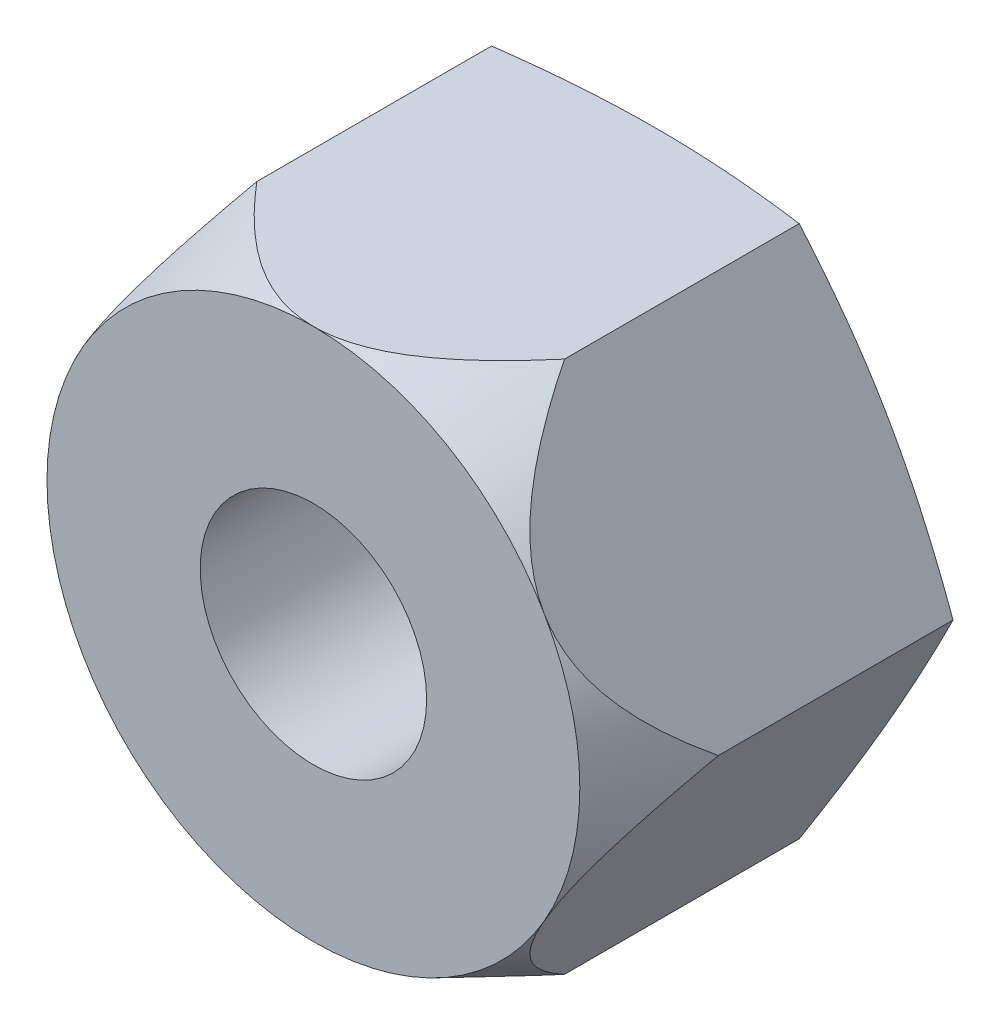
ISO-10303-21;
HEADER;
FILE_DESCRIPTION(('STEP AP214'),'2;1');
FILE_NAME('part.step','',(''),(''),'','','');
FILE_SCHEMA(('AUTOMOTIVE_DESIGN { 1 0 10303 214 1 1 1 1 }'));
ENDSEC;
DATA;
#1=APPLICATION_CONTEXT('core data for automotive mechanical design processes');
#2=APPLICATION_PROTOCOL_DEFINITION('international standard','automotive_design',2000,#1);
#3=PRODUCT_CONTEXT('',#1,'mechanical');
#4=PRODUCT('Part','Part','',(#3));
#5=PRODUCT_RELATED_PRODUCT_CATEGORY('part','',(#4));
#6=PRODUCT_DEFINITION_FORMATION('','',#4);
#7=PRODUCT_DEFINITION_CONTEXT('part definition',#1,'design');
#8=PRODUCT_DEFINITION('design','',#6,#7);
#9=PRODUCT_DEFINITION_SHAPE('','',#8);
#10=(LENGTH_UNIT() NAMED_UNIT(*) SI_UNIT(.MILLI.,.METRE.));
#11=(NAMED_UNIT(*) PLANE_ANGLE_UNIT() SI_UNIT($,.RADIAN.));
#12=(NAMED_UNIT(*) SI_UNIT($,.STERADIAN.) SOLID_ANGLE_UNIT());
#13=UNCERTAINTY_MEASURE_WITH_UNIT(LENGTH_MEASURE(1.E-05),#10,'distance_accuracy_value','');
#14=(GEOMETRIC_REPRESENTATION_CONTEXT(3) GLOBAL_UNCERTAINTY_ASSIGNED_CONTEXT((#13)) GLOBAL_UNIT_ASSIGNED_CONTEXT((#10,
#11,#12)) REPRESENTATION_CONTEXT('',''));
#15=CARTESIAN_POINT('',(0.,0.,0.));
#16=DIRECTION('',(0.,0.,1.));
#17=DIRECTION('',(1.,0.,0.));
#18=AXIS2_PLACEMENT_3D('',#15,#16,#17);
#19=CARTESIAN_POINT('',(0.,0.,-4.98224576043072));
#20=DIRECTION('',(0.,0.,1.));
#21=DIRECTION('',(1.,0.,0.));
#22=AXIS2_PLACEMENT_3D('',#19,#20,#21);
#23=CONICAL_SURFACE('',#22,4.62587496639344,1.30899693900267);
#24=CARTESIAN_POINT('',(-4.6188021535193,3.97450486742227E-12,-4.98414091492851));
#25=CARTESIAN_POINT('',(-4.52289851680874,-0.16610997140934,-5.00984794253957));
#26=CARTESIAN_POINT('',(-4.42682100646454,-0.332521100790216,-5.03318560339601));
#27=CARTESIAN_POINT('',(-4.23432671142184,-0.665930999971338,-5.07418759006574));
#28=CARTESIAN_POINT('',(-4.13790980496555,-0.832929980662246,-5.09184961193811));
#29=CARTESIAN_POINT('',(-3.94532123852523,-1.16650316269373,-5.12046930776978));
#30=CARTESIAN_POINT('',(-3.84915088056777,-1.33307510885814,-5.13146110886302));
#31=CARTESIAN_POINT('',(-3.65668753523402,-1.66643140157086,-5.14619998039367));
#32=CARTESIAN_POINT('',(-3.56039457518647,-1.83321570078443,-5.14994845223402));
#33=CARTESIAN_POINT('',(-3.36780865509136,-2.16678429921156,-5.14994845223408));
#34=CARTESIAN_POINT('',(-3.2715156950438,-2.33356859842513,-5.14619998039379));
#35=CARTESIAN_POINT('',(-3.07905234971006,-2.66692489113785,-5.13146110886325));
#36=CARTESIAN_POINT('',(-2.98288199175259,-2.83349683730227,-5.12046930777007));
#37=CARTESIAN_POINT('',(-2.79029342531227,-3.16707001933376,-5.0918496119385));
#38=CARTESIAN_POINT('',(-2.69387651885598,-3.33406900002467,-5.07418759006618));
#39=CARTESIAN_POINT('',(-2.50138222381327,-3.6674788992058,-5.03318560339655));
#40=CARTESIAN_POINT('',(-2.40530471346906,-3.83389002858668,-5.00984794254014));
#41=CARTESIAN_POINT('',(-2.3094010767585,-4.,-4.98414091492912));
#42=B_SPLINE_CURVE_WITH_KNOTS('',3,(#24,#25,#26,#27,#28,#29,#30,#31,#32,#33,#34,#35,#36,#37,#38,
#39,#40,#41),.UNSPECIFIED.,.F.,.F.,(4,2,2,2,2,2,2,2,4),(0.,0.580597318357496,1.16143002467372,
1.73926537056134,2.31698890857221,2.89471244658308,3.4725477924707,4.05338049878692,
4.63397781714442),.UNSPECIFIED.);
#43=CARTESIAN_POINT('',(-4.61880215351584,0.,-4.98414091494226));
#44=VERTEX_POINT('',#43);
#45=CARTESIAN_POINT('',(-2.30940107675851,-4.,-4.98414091492912));
#46=VERTEX_POINT('',#45);
#47=EDGE_CURVE('E282',#44,#46,#42,.T.);
#48=ORIENTED_EDGE('',*,*,#47,.F.);
#49=CARTESIAN_POINT('',(-2.3094010767585,4.,-4.98414091492912));
#50=CARTESIAN_POINT('',(-2.40530471346906,3.83389002858668,-5.00984794254015));
#51=CARTESIAN_POINT('',(-2.50138222381326,3.6674788992058,-5.03318560339655));
#52=CARTESIAN_POINT('',(-2.69387651885598,3.33406900002467,-5.07418759006618));
#53=CARTESIAN_POINT('',(-2.79029342531227,3.16707001933375,-5.0918496119385));
#54=CARTESIAN_POINT('',(-2.98288199175259,2.83349683730227,-5.12046930777007));
#55=CARTESIAN_POINT('',(-3.07905234971005,2.66692489113785,-5.13146110886325));
#56=CARTESIAN_POINT('',(-3.2715156950438,2.33356859842512,-5.14619998039379));
#57=CARTESIAN_POINT('',(-3.36780865509136,2.16678429921156,-5.14994845223408));
#58=CARTESIAN_POINT('',(-3.56039457518647,1.83321570078442,-5.14994845223402));
#59=CARTESIAN_POINT('',(-3.65668753523402,1.66643140157086,-5.14619998039367));
#60=CARTESIAN_POINT('',(-3.84915088056777,1.33307510885814,-5.13146110886302));
#61=CARTESIAN_POINT('',(-3.94532123852523,1.16650316269373,-5.12046930776978));
#62=CARTESIAN_POINT('',(-4.13790980496555,0.832929980662245,-5.09184961193811));
#63=CARTESIAN_POINT('',(-4.23432671142184,0.665930999971338,-5.07418759006574));
#64=CARTESIAN_POINT('',(-4.42682100646454,0.332521100790216,-5.03318560339601));
#65=CARTESIAN_POINT('',(-4.52289851680874,0.16610997140934,-5.00984794253957));
#66=CARTESIAN_POINT('',(-4.6188021535193,-3.97411267426706E-12,-4.98414091492851));
#67=B_SPLINE_CURVE_WITH_KNOTS('',3,(#49,#50,#51,#52,#53,#54,#55,#56,#57,#58,#59,#60,#61,#62,#63,
#64,#65,#66),.UNSPECIFIED.,.F.,.F.,(4,2,2,2,2,2,2,2,4),(0.,0.580597318357498,1.16143002467372,
1.73926537056135,2.31698890857221,2.89471244658308,3.4725477924707,4.05338049878692,
4.63397781714442),.UNSPECIFIED.);
#68=CARTESIAN_POINT('',(-2.30940107675851,4.,-4.98414091492912));
#69=VERTEX_POINT('',#68);
#70=EDGE_CURVE('E102',#69,#44,#67,.T.);
#71=ORIENTED_EDGE('',*,*,#70,.F.);
#72=CARTESIAN_POINT('',(2.3094010767585,4.,-4.98414091492912));
#73=CARTESIAN_POINT('',(2.11759380333757,4.,-5.00984794254012));
#74=CARTESIAN_POINT('',(1.92543878264936,4.,-5.0331856033965));
#75=CARTESIAN_POINT('',(1.54045019256432,4.,-5.0741875900661));
#76=CARTESIAN_POINT('',(1.34761637965193,4.,-5.09184961193842));
#77=CARTESIAN_POINT('',(0.962439246771681,4.,-5.12046930776998));
#78=CARTESIAN_POINT('',(0.770098530856941,4.,-5.13146110886317));
#79=CARTESIAN_POINT('',(0.385171840189831,4.,-5.14619998039373));
#80=CARTESIAN_POINT('',(0.192585920094911,4.,-5.14994845223405));
#81=CARTESIAN_POINT('',(-0.19258592009493,4.,-5.14994845223405));
#82=CARTESIAN_POINT('',(-0.385171840189851,4.,-5.14619998039373));
#83=CARTESIAN_POINT('',(-0.770098530856961,4.,-5.13146110886317));
#84=CARTESIAN_POINT('',(-0.962439246771701,4.,-5.12046930776998));
#85=CARTESIAN_POINT('',(-1.34761637965195,4.,-5.09184961193841));
#86=CARTESIAN_POINT('',(-1.54045019256434,4.,-5.0741875900661));
#87=CARTESIAN_POINT('',(-1.92543878264938,4.,-5.0331856033965));
#88=CARTESIAN_POINT('',(-2.11759380333759,4.,-5.00984794254012));
#89=CARTESIAN_POINT('',(-2.30940107675852,4.,-4.98414091492912));
#90=B_SPLINE_CURVE_WITH_KNOTS('',3,(#72,#73,#74,#75,#76,#77,#78,#79,#80,#81,#82,#83,#84,#85,#86,
#87,#88,#89),.UNSPECIFIED.,.F.,.F.,(4,2,2,2,2,2,2,2,4),(0.,0.580597318356917,1.16143002467256,
1.73926537055961,2.3169889085699,2.8947124465802,3.47254779246724,4.05338049878289,
4.63397781713981),.UNSPECIFIED.);
#91=CARTESIAN_POINT('',(2.30940107675849,4.,-4.98414091492912));
#92=VERTEX_POINT('',#91);
#93=EDGE_CURVE('E96',#92,#69,#90,.T.);
#94=ORIENTED_EDGE('',*,*,#93,.F.);
#95=CARTESIAN_POINT('',(4.61880215351929,-3.98376161446537E-12,-4.98414091492851));
#96=CARTESIAN_POINT('',(4.52289851680873,0.166109971409331,-5.00984794253957));
#97=CARTESIAN_POINT('',(4.42682100646454,0.332521100790208,-5.03318560339601));
#98=CARTESIAN_POINT('',(4.23432671142183,0.665930999971331,-5.07418759006574));
#99=CARTESIAN_POINT('',(4.13790980496554,0.83292998066224,-5.09184961193811));
#100=CARTESIAN_POINT('',(3.94532123852522,1.16650316269372,-5.12046930776978));
#101=CARTESIAN_POINT('',(3.84915088056776,1.33307510885814,-5.13146110886302));
#102=CARTESIAN_POINT('',(3.65668753523401,1.66643140157086,-5.14619998039367));
#103=CARTESIAN_POINT('',(3.56039457518646,1.83321570078442,-5.14994845223402));
#104=CARTESIAN_POINT('',(3.36780865509135,2.16678429921156,-5.14994845223408));
#105=CARTESIAN_POINT('',(3.27151569504379,2.33356859842512,-5.14619998039379));
#106=CARTESIAN_POINT('',(3.07905234971004,2.66692489113785,-5.13146110886325));
#107=CARTESIAN_POINT('',(2.98288199175258,2.83349683730227,-5.12046930777007));
#108=CARTESIAN_POINT('',(2.79029342531226,3.16707001933376,-5.0918496119385));
#109=CARTESIAN_POINT('',(2.69387651885596,3.33406900002467,-5.07418759006618));
#110=CARTESIAN_POINT('',(2.50138222381325,3.6674788992058,-5.03318560339655));
#111=CARTESIAN_POINT('',(2.40530471346905,3.83389002858669,-5.00984794254015));
#112=CARTESIAN_POINT('',(2.30940107675849,4.00000000000001,-4.98414091492912));
#113=B_SPLINE_CURVE_WITH_KNOTS('',3,(#95,#96,#97,#98,#99,#100,#101,#102,#103,#104,#105,#106,
#107,#108,#109,#110,#111,#112),.UNSPECIFIED.,.F.,.F.,(4,2,2,2,2,2,2,2,4),(0.,0.580597318357499,
1.16143002467372,1.73926537056135,2.31698890857221,2.89471244658308,3.47254779247071,
4.05338049878694,4.63397781714444),.UNSPECIFIED.);
#114=CARTESIAN_POINT('',(4.61880215358719,0.,-4.98414091492805));
#115=VERTEX_POINT('',#114);
#116=EDGE_CURVE('E85',#115,#92,#113,.T.);
#117=ORIENTED_EDGE('',*,*,#116,.F.);
#118=CARTESIAN_POINT('',(2.3094010767585,-4.00000000000001,-4.98414091492912));
#119=CARTESIAN_POINT('',(2.40530471346906,-3.83389002858669,-5.00984794254014));
#120=CARTESIAN_POINT('',(2.50138222381326,-3.66747889920581,-5.03318560339655));
#121=CARTESIAN_POINT('',(2.69387651885598,-3.33406900002467,-5.07418759006618));
#122=CARTESIAN_POINT('',(2.79029342531227,-3.16707001933376,-5.0918496119385));
#123=CARTESIAN_POINT('',(2.98288199175259,-2.83349683730227,-5.12046930777007));
#124=CARTESIAN_POINT('',(3.07905234971005,-2.66692489113786,-5.13146110886325));
#125=CARTESIAN_POINT('',(3.2715156950438,-2.33356859842513,-5.14619998039378));
#126=CARTESIAN_POINT('',(3.36780865509136,-2.16678429921157,-5.14994845223408));
#127=CARTESIAN_POINT('',(3.56039457518647,-1.83321570078443,-5.14994845223402));
#128=CARTESIAN_POINT('',(3.65668753523402,-1.66643140157087,-5.14619998039367));
#129=CARTESIAN_POINT('',(3.84915088056777,-1.33307510885815,-5.13146110886301));
#130=CARTESIAN_POINT('',(3.94532123852523,-1.16650316269373,-5.12046930776978));
#131=CARTESIAN_POINT('',(4.13790980496555,-0.832929980662255,-5.0918496119381));
#132=CARTESIAN_POINT('',(4.23432671142184,-0.665930999971347,-5.07418759006573));
#133=CARTESIAN_POINT('',(4.42682100646454,-0.332521100790225,-5.03318560339601));
#134=CARTESIAN_POINT('',(4.52289851680874,-0.166109971409349,-5.00984794253957));
#135=CARTESIAN_POINT('',(4.6188021535193,3.96478950255242E-12,-4.9841409149285));
#136=B_SPLINE_CURVE_WITH_KNOTS('',3,(#118,#119,#120,#121,#122,#123,#124,#125,#126,#127,#128,
#129,#130,#131,#132,#133,#134,#135),.UNSPECIFIED.,.F.,.F.,(4,2,2,2,2,2,2,2,4),(0.,
0.580597318357498,1.16143002467372,1.73926537056135,2.31698890857221,2.89471244658308,
3.4725477924707,4.05338049878692,4.63397781714442),.UNSPECIFIED.);
#137=CARTESIAN_POINT('',(2.30940107675851,-4.,-4.98414091492912));
#138=VERTEX_POINT('',#137);
#139=EDGE_CURVE('E109',#138,#115,#136,.T.);
#140=ORIENTED_EDGE('',*,*,#139,.F.);
#141=CARTESIAN_POINT('',(-2.30940107675852,-4.,-4.98414091492912));
#142=CARTESIAN_POINT('',(-2.11759380333759,-4.,-5.00984794254012));
#143=CARTESIAN_POINT('',(-1.92543878264938,-4.,-5.0331856033965));
#144=CARTESIAN_POINT('',(-1.54045019256434,-4.,-5.0741875900661));
#145=CARTESIAN_POINT('',(-1.34761637965195,-4.,-5.09184961193841));
#146=CARTESIAN_POINT('',(-0.962439246771699,-4.,-5.12046930776998));
#147=CARTESIAN_POINT('',(-0.770098530856958,-4.,-5.13146110886317));
#148=CARTESIAN_POINT('',(-0.385171840189846,-4.,-5.14619998039373));
#149=CARTESIAN_POINT('',(-0.192585920094925,-4.,-5.14994845223405));
#150=CARTESIAN_POINT('',(0.192585920094917,-4.,-5.14994845223405));
#151=CARTESIAN_POINT('',(0.385171840189838,-4.,-5.14619998039373));
#152=CARTESIAN_POINT('',(0.770098530856949,-4.,-5.13146110886317));
#153=CARTESIAN_POINT('',(0.96243924677169,-4.,-5.12046930776998));
#154=CARTESIAN_POINT('',(1.34761637965194,-4.,-5.09184961193842));
#155=CARTESIAN_POINT('',(1.54045019256433,-4.,-5.0741875900661));
#156=CARTESIAN_POINT('',(1.92543878264937,-4.,-5.0331856033965));
#157=CARTESIAN_POINT('',(2.11759380333758,-4.,-5.00984794254012));
#158=CARTESIAN_POINT('',(2.30940107675851,-4.,-4.98414091492912));
#159=B_SPLINE_CURVE_WITH_KNOTS('',3,(#141,#142,#143,#144,#145,#146,#147,#148,#149,#150,#151,
#152,#153,#154,#155,#156,#157,#158),.UNSPECIFIED.,.F.,.F.,(4,2,2,2,2,2,2,2,4),(0.,
0.580597318356918,1.16143002467256,1.73926537055961,2.31698890856991,2.89471244658021,
3.47254779246725,4.0533804987829,4.63397781713982),.UNSPECIFIED.);
#160=EDGE_CURVE('E227',#46,#138,#159,.T.);
#161=ORIENTED_EDGE('',*,*,#160,.F.);
#162=EDGE_LOOP('',(#48,#71,#94,#117,#140,#161));
#163=FACE_BOUND('',#162,.T.);
#164=CARTESIAN_POINT('',(0.,0.,-5.30000000000337));
#165=DIRECTION('',(0.,0.,1.));
#166=DIRECTION('',(1.,0.,0.));
#167=AXIS2_PLACEMENT_3D('',#164,#165,#166);
#168=CIRCLE('',#167,3.43999999995503);
#169=CARTESIAN_POINT('',(3.43999999995504,0.,-5.30000000000337));
#170=VERTEX_POINT('',#169);
#171=EDGE_CURVE('E21',#170,#170,#168,.F.);
#172=ORIENTED_EDGE('',*,*,#171,.F.);
#173=EDGE_LOOP('',(#172));
#174=FACE_BOUND('',#173,.T.);
#175=ADVANCED_FACE('F17',(#163,#174),#23,.T.);
#176=CARTESIAN_POINT('',(-2.30940107675851,-4.,-5.3));
#177=DIRECTION('',(0.,0.,-1.));
#178=DIRECTION('',(-1.,0.,0.));
#179=AXIS2_PLACEMENT_3D('',#176,#177,#178);
#180=PLANE('',#179);
#181=CARTESIAN_POINT('',(0.,0.,-5.29999999997699));
#182=DIRECTION('',(0.,0.,-1.));
#183=DIRECTION('',(-1.,0.,0.));
#184=AXIS2_PLACEMENT_3D('',#181,#182,#183);
#185=CIRCLE('',#184,2.18571428570158);
#186=CARTESIAN_POINT('',(-2.18571428570158,0.,-5.29999999997699));
#187=VERTEX_POINT('',#186);
#188=EDGE_CURVE('E173',#187,#187,#185,.F.);
#189=ORIENTED_EDGE('',*,*,#188,.T.);
#190=EDGE_LOOP('',(#189));
#191=FACE_BOUND('',#190,.T.);
#192=ORIENTED_EDGE('',*,*,#171,.T.);
#193=EDGE_LOOP('',(#192));
#194=FACE_BOUND('',#193,.T.);
#195=ADVANCED_FACE('F209',(#191,#194),#180,.T.);
#196=CARTESIAN_POINT('',(2.3094010767585,4.,-5.3));
#197=DIRECTION('',(0.,1.,0.));
#198=DIRECTION('',(0.,0.,1.));
#199=AXIS2_PLACEMENT_3D('',#196,#197,#198);
#200=PLANE('',#199);
#201=DIRECTION('',(0.,0.,1.));
#202=VECTOR('',#201,1.);
#203=CARTESIAN_POINT('',(-2.3094010767585,3.99999999999999,-5.3));
#204=LINE('',#203,#202);
#205=CARTESIAN_POINT('',(-2.3094010767585,4.,-1.46000000001793));
#206=VERTEX_POINT('',#205);
#207=EDGE_CURVE('E288',#206,#69,#204,.F.);
#208=ORIENTED_EDGE('',*,*,#207,.F.);
#209=CARTESIAN_POINT('',(0.,4.,-3.22090205740249E-11));
#210=CARTESIAN_POINT('',(-0.0537784669086683,4.,3.33773102398751E-05));
#211=CARTESIAN_POINT('',(-0.107536978097439,4.,-0.00255779469879392));
#212=CARTESIAN_POINT('',(-0.214493796358574,4.,-0.012728405164682));
#213=CARTESIAN_POINT('',(-0.267692881313333,4.,-0.0202996071916052));
#214=CARTESIAN_POINT('',(-0.372186558712668,4.,-0.0399818476691536));
#215=CARTESIAN_POINT('',(-0.423498127008806,4.,-0.0520037081479562));
#216=CARTESIAN_POINT('',(-0.524978040147191,4.,-0.080191506086133));
#217=CARTESIAN_POINT('',(-0.575145857851012,4.,-0.0963593139282062));
#218=CARTESIAN_POINT('',(-0.761818150694413,4.,-0.164322984169127));
#219=CARTESIAN_POINT('',(-0.893874577135787,4.,-0.228506313186122));
#220=CARTESIAN_POINT('',(-1.14834058570262,4.,-0.376799470928344));
#221=CARTESIAN_POINT('',(-1.27057011529377,4.,-0.461201171937723));
#222=CARTESIAN_POINT('',(-1.4747325651839,4.,-0.619132453478493));
#223=CARTESIAN_POINT('',(-1.55891031365921,4.,-0.689826568359658));
#224=CARTESIAN_POINT('',(-1.7226703586599,4.,-0.836452685587209));
#225=CARTESIAN_POINT('',(-1.80224875046165,4.,-0.91238902182539));
#226=CARTESIAN_POINT('',(-1.95484377511185,4.,-1.06551921784311));
#227=CARTESIAN_POINT('',(-2.02799124175388,4.,-1.14258403691733));
#228=CARTESIAN_POINT('',(-2.17098783749922,4.,-1.29941806890039));
#229=CARTESIAN_POINT('',(-2.24084376023403,4.,-1.37918107007029));
#230=CARTESIAN_POINT('',(-2.30940104684113,4.,-1.45999996474238));
#231=B_SPLINE_CURVE_WITH_KNOTS('',3,(#209,#210,#211,#212,#213,#214,#215,#216,#217,#218,#219,
#220,#221,#222,#223,#224,#225,#226,#227,#228,#229,#230),.UNSPECIFIED.,.F.,.F.,(4,2,2,2,2,2,2,2,
2,2,4),(0.,0.16124098575657,0.322215964679933,0.48012615464331,0.638107709162955,
1.07587782815675,1.52039511682573,1.84992335772821,2.17972736910376,2.49839517165825,
2.81637352980213),.UNSPECIFIED.);
#232=CARTESIAN_POINT('',(0.,4.00000000000522,-4.4526033373853E-11));
#233=VERTEX_POINT('',#232);
#234=EDGE_CURVE('E172',#233,#206,#231,.T.);
#235=ORIENTED_EDGE('',*,*,#234,.F.);
#236=CARTESIAN_POINT('',(2.30940103065065,3.99999999369635,-1.45999994891579));
#237=CARTESIAN_POINT('',(2.26530046156806,3.99999999767564,-1.40798095750892));
#238=CARTESIAN_POINT('',(2.2206560777249,3.99999999936311,-1.35642434261895));
#239=CARTESIAN_POINT('',(2.13013237326658,4.00000000063709,-1.25438039860766));
#240=CARTESIAN_POINT('',(2.08425268638726,4.00000000022296,-1.20389339473106));
#241=CARTESIAN_POINT('',(1.94390024767038,3.99999999955082,-1.05357249315271));
#242=CARTESIAN_POINT('',(1.84735383691979,3.99999999987745,-0.955642878771101));
#243=CARTESIAN_POINT('',(1.64302743666835,4.00000000012804,-0.762641424038905));
#244=CARTESIAN_POINT('',(1.53493795617419,4.0000000000333,-0.667894156896339));
#245=CARTESIAN_POINT('',(1.30988675002703,3.99999999996681,-0.490006633784196));
#246=CARTESIAN_POINT('',(1.19295612201515,3.99999999999465,-0.406828371796886));
#247=CARTESIAN_POINT('',(1.02062803664969,4.00000000000219,-0.30170895528666));
#248=CARTESIAN_POINT('',(0.969609414312936,4.0000000000006,-0.27258253429274));
#249=CARTESIAN_POINT('',(0.865746618975963,3.9999999999994,-0.217779364108761));
#250=CARTESIAN_POINT('',(0.812901990955628,3.99999999999979,-0.192103482661984));
#251=CARTESIAN_POINT('',(0.65301047541937,4.00000000000041,-0.121785300131507));
#252=CARTESIAN_POINT('',(0.543221636241228,4.00000000000009,-0.0829759309315579));
#253=CARTESIAN_POINT('',(0.360877257342339,3.99999999999994,-0.0369135205006762));
#254=CARTESIAN_POINT('',(0.28991408374772,3.99999999999997,-0.0232784276174035));
#255=CARTESIAN_POINT('',(0.146014698710497,4.00000000000003,-0.00472326376504452));
#256=CARTESIAN_POINT('',(0.0730650705247637,4.00000000000006,9.15862542672063E-05));
#257=CARTESIAN_POINT('',(0.,4.,-3.22093049741718E-11));
#258=B_SPLINE_CURVE_WITH_KNOTS('',3,(#236,#237,#238,#239,#240,#241,#242,#243,#244,#245,#246,
#247,#248,#249,#250,#251,#252,#253,#254,#255,#256,#257),.UNSPECIFIED.,.F.,.F.,(4,2,2,2,2,2,2,2,
2,2,4),(0.,0.204582629009847,0.409226599130053,0.821501014047106,1.25224519084228,
1.68153907824911,1.85766275158224,2.03383063402477,2.38129134616519,2.59756782690322,
2.81640797996938),.UNSPECIFIED.);
#259=CARTESIAN_POINT('',(2.30940107675849,4.,-1.46000000001792));
#260=VERTEX_POINT('',#259);
#261=EDGE_CURVE('E108',#260,#233,#258,.T.);
#262=ORIENTED_EDGE('',*,*,#261,.F.);
#263=DIRECTION('',(0.,0.,1.));
#264=VECTOR('',#263,1.);
#265=CARTESIAN_POINT('',(2.30940107675849,4.,-5.3));
#266=LINE('',#265,#264);
#267=EDGE_CURVE('E90',#92,#260,#266,.T.);
#268=ORIENTED_EDGE('',*,*,#267,.F.);
#269=ORIENTED_EDGE('',*,*,#93,.T.);
#270=EDGE_LOOP('',(#208,#235,#262,#268,#269));
#271=FACE_BOUND('',#270,.T.);
#272=ADVANCED_FACE('F106',(#271),#200,.T.);
#273=CARTESIAN_POINT('',(4.618802153517,0.,-5.3));
#274=DIRECTION('',(0.866025403784439,0.5,0.));
#275=DIRECTION('',(-0.5,0.866025403784439,0.));
#276=AXIS2_PLACEMENT_3D('',#273,#274,#275);
#277=PLANE('',#276);
#278=ORIENTED_EDGE('',*,*,#267,.T.);
#279=CARTESIAN_POINT('',(3.46410161513774,1.99999999999999,-3.21805770030596E-11));
#280=CARTESIAN_POINT('',(3.43721238168341,2.04657351851948,3.33773102659437E-05));
#281=CARTESIAN_POINT('',(3.41033312608903,2.09312975487859,-0.00255779469876763));
#282=CARTESIAN_POINT('',(3.35685471695846,2.18575707660069,-0.0127284051646542));
#283=CARTESIAN_POINT('',(3.33025517448108,2.23182883562959,-0.020299607191576));
#284=CARTESIAN_POINT('',(3.27800833578141,2.32232301479227,-0.0399818476691246));
#285=CARTESIAN_POINT('',(3.25235255163334,2.36676013644475,-0.0520037081479288));
#286=CARTESIAN_POINT('',(3.20161259506415,2.45464431919643,-0.0801915060861058));
#287=CARTESIAN_POINT('',(3.17652868621224,2.49809092378036,-0.0963593139281776));
#288=CARTESIAN_POINT('',(3.08319253979054,2.65975387156544,-0.164322984169096));
#289=CARTESIAN_POINT('',(3.01716432656985,2.77411809159666,-0.228506313186093));
#290=CARTESIAN_POINT('',(2.88993132228644,2.99449211941516,-0.376799470928318));
#291=CARTESIAN_POINT('',(2.82881655749086,3.10034599713372,-0.461201171937696));
#292=CARTESIAN_POINT('',(2.72673533254579,3.27715586523744,-0.619132453478467));
#293=CARTESIAN_POINT('',(2.68464645830814,3.35005593385044,-0.689826568359634));
#294=CARTESIAN_POINT('',(2.60276643580779,3.49187629294592,-0.836452685587192));
#295=CARTESIAN_POINT('',(2.56297723990691,3.56079320183856,-0.912389021825375));
#296=CARTESIAN_POINT('',(2.48667972758181,3.69294436967674,-1.0655192178431));
#297=CARTESIAN_POINT('',(2.4501059942608,3.75629193401122,-1.14258403691732));
#298=CARTESIAN_POINT('',(2.37860769638813,3.88013061858138,-1.29941806890039));
#299=CARTESIAN_POINT('',(2.34367973502072,3.94062762227453,-1.3791810700703));
#300=CARTESIAN_POINT('',(2.30940109171717,3.99999997409081,-1.45999996474239));
#301=B_SPLINE_CURVE_WITH_KNOTS('',3,(#279,#280,#281,#282,#283,#284,#285,#286,#287,#288,#289,
#290,#291,#292,#293,#294,#295,#296,#297,#298,#299,#300),.UNSPECIFIED.,.F.,.F.,(4,2,2,2,2,2,2,2,
2,2,4),(0.,0.16124098575657,0.322215964679932,0.480126154643309,0.638107709162953,
1.07587782815674,1.52039511682573,1.84992335772822,2.17972736910379,2.49839517165828,
2.81637352980217),.UNSPECIFIED.);
#302=CARTESIAN_POINT('',(3.46410161514227,2.00000000000261,-4.4511267976809E-11));
#303=VERTEX_POINT('',#302);
#304=EDGE_CURVE('E196',#303,#260,#301,.T.);
#305=ORIENTED_EDGE('',*,*,#304,.F.);
#306=CARTESIAN_POINT('',(4.61880212499043,3.6787614335499E-08,-1.45999994888662));
#307=CARTESIAN_POINT('',(4.59675184389973,0.0381922519256412,-1.40798095747921));
#308=CARTESIAN_POINT('',(4.57442965344133,0.0768554233146349,-1.35642434258928));
#309=CARTESIAN_POINT('',(4.52916780231666,0.155251251658089,-1.25438039857866));
#310=CARTESIAN_POINT('',(4.50622795851775,0.194984225806293,-1.20389339470267));
#311=CARTESIAN_POINT('',(4.43605173857603,0.31653300288264,-1.05357249312607));
#312=CARTESIAN_POINT('',(4.38777853348369,0.400144647400781,-0.955642878745486));
#313=CARTESIAN_POINT('',(4.28561533357473,0.577096500808674,-0.762641424015774));
#314=CARTESIAN_POINT('',(4.23157059324524,0.670704736751517,-0.667894156874666));
#315=CARTESIAN_POINT('',(4.11904499011351,0.865604798394887,-0.490006633765625));
#316=CARTESIAN_POINT('',(4.06057967613147,0.966869692747998,-0.40682837177996));
#317=CARTESIAN_POINT('',(3.97441563345485,1.11611019246453,-0.301708955272084));
#318=CARTESIAN_POINT('',(3.94890632228488,1.16029361547381,-0.272582534278774));
#319=CARTESIAN_POINT('',(3.89697492461493,1.25024143474382,-0.217779364096095));
#320=CARTESIAN_POINT('',(3.8705526106049,1.29600622506351,-0.192103482650007));
#321=CARTESIAN_POINT('',(3.79060685283671,1.43447633936885,-0.121785300121683));
#322=CARTESIAN_POINT('',(3.73571243324699,1.52955626314961,-0.0829759309233174));
#323=CARTESIAN_POINT('',(3.64454024379892,1.68747112751067,-0.0369135204961692));
#324=CARTESIAN_POINT('',(3.60905865700352,1.74892703857352,-0.0232784276145274));
#325=CARTESIAN_POINT('',(3.5371089644889,1.87354756159793,-0.00472326376443156));
#326=CARTESIAN_POINT('',(3.50063415039811,1.93672379279986,9.15862542707435E-05));
#327=CARTESIAN_POINT('',(3.46410161513774,1.99999999999999,-3.21818771141873E-11));
#328=B_SPLINE_CURVE_WITH_KNOTS('',3,(#306,#307,#308,#309,#310,#311,#312,#313,#314,#315,#316,
#317,#318,#319,#320,#321,#322,#323,#324,#325,#326,#327),.UNSPECIFIED.,.F.,.F.,(4,2,2,2,2,2,2,2,
2,2,4),(0.,0.20458262900929,0.409226599128912,0.821501014044796,1.25224519083827,
1.6815390782434,1.85766275157673,2.03383063401945,2.38129134616035,2.59756782688644,
2.81640797994028),.UNSPECIFIED.);
#329=CARTESIAN_POINT('',(4.618802153517,0.,-1.46000000000998));
#330=VERTEX_POINT('',#329);
#331=EDGE_CURVE('E257',#330,#303,#328,.T.);
#332=ORIENTED_EDGE('',*,*,#331,.F.);
#333=DIRECTION('',(0.,0.,1.));
#334=VECTOR('',#333,1.);
#335=CARTESIAN_POINT('',(4.618802153517,0.,-5.3));
#336=LINE('',#335,#334);
#337=EDGE_CURVE('E93',#115,#330,#336,.T.);
#338=ORIENTED_EDGE('',*,*,#337,.F.);
#339=ORIENTED_EDGE('',*,*,#116,.T.);
#340=EDGE_LOOP('',(#278,#305,#332,#338,#339));
#341=FACE_BOUND('',#340,.T.);
#342=ADVANCED_FACE('F87',(#341),#277,.T.);
#343=CARTESIAN_POINT('',(2.30940107675851,-4.,-5.3));
#344=DIRECTION('',(0.866025403784438,-0.5,0.));
#345=DIRECTION('',(0.5,0.866025403784438,0.));
#346=AXIS2_PLACEMENT_3D('',#343,#344,#345);
#347=PLANE('',#346);
#348=ORIENTED_EDGE('',*,*,#337,.T.);
#349=CARTESIAN_POINT('',(3.46410161513776,-2.,-3.22168373487807E-11));
#350=CARTESIAN_POINT('',(3.49099084859236,-1.95342648148005,3.33773102328E-05));
#351=CARTESIAN_POINT('',(3.51787010418702,-1.90687024512047,-0.00255779469882396));
#352=CARTESIAN_POINT('',(3.57134851331812,-1.81424292339745,-0.0127284051648041));
#353=CARTESIAN_POINT('',(3.59794805579577,-1.76817116436808,-0.0202996071917964));
#354=CARTESIAN_POINT('',(3.65019489449596,-1.67767698520448,-0.0399818476695279));
#355=CARTESIAN_POINT('',(3.6758506786443,-1.63323986355155,-0.0520037081484447));
#356=CARTESIAN_POINT('',(3.72659063521401,-1.54535568079896,-0.0801915060868869));
#357=CARTESIAN_POINT('',(3.75167454406618,-1.50190907621458,-0.0963593139291112));
#358=CARTESIAN_POINT('',(3.84501069048895,-1.34024612842765,-0.164322984170745));
#359=CARTESIAN_POINT('',(3.91103890371043,-1.22588190839507,-0.228506313188461));
#360=CARTESIAN_POINT('',(4.03827190799534,-1.00550788057397,-0.376799470932327));
#361=CARTESIAN_POINT('',(4.09938667279163,-0.89965400285417,-0.461201171942623));
#362=CARTESIAN_POINT('',(4.20146789773581,-0.722844134751978,-0.619132453481869));
#363=CARTESIAN_POINT('',(4.24355677197201,-0.649944066141505,-0.689826568360233));
#364=CARTESIAN_POINT('',(4.32543679446963,-0.508123707050751,-0.836452685581804));
#365=CARTESIAN_POINT('',(4.36522599036923,-0.43920679816033,-0.912389021816803));
#366=CARTESIAN_POINT('',(4.44152350269204,-0.307055630326118,-1.06551921782818));
#367=CARTESIAN_POINT('',(4.47809723601202,-0.243708065993424,-1.14258403689925));
#368=CARTESIAN_POINT('',(4.54959553388275,-0.119869381426635,-1.29941806887592));
#369=CARTESIAN_POINT('',(4.58452349524924,-0.0593723777350766,-1.37918107004256));
#370=CARTESIAN_POINT('',(4.6188021385519,-2.59203257906185E-08,-1.45999996471135));
#371=B_SPLINE_CURVE_WITH_KNOTS('',3,(#349,#350,#351,#352,#353,#354,#355,#356,#357,#358,#359,
#360,#361,#362,#363,#364,#365,#366,#367,#368,#369,#370),.UNSPECIFIED.,.F.,.F.,(4,2,2,2,2,2,2,2,
2,2,4),(0.,0.161240985758186,0.322215964683161,0.480126154648154,0.638107709169415,
1.07587782816836,1.52039511684243,1.84992335773285,2.17972736909631,2.49839517163972,
2.81637352977262),.UNSPECIFIED.);
#372=CARTESIAN_POINT('',(3.46410161514228,-2.00000000000261,-4.45285445292191E-11));
#373=VERTEX_POINT('',#372);
#374=EDGE_CURVE('E250',#373,#330,#371,.T.);
#375=ORIENTED_EDGE('',*,*,#374,.F.);
#376=CARTESIAN_POINT('',(2.30940107885154,-3.99999996256347,-1.45999996933289));
#377=CARTESIAN_POINT('',(2.33145137177033,-3.9618077562503,-1.40798097623179));
#378=CARTESIAN_POINT('',(2.35377356723357,-3.92314458862266,-1.35642436048975));
#379=CARTESIAN_POINT('',(2.39903542210548,-3.84474876317305,-1.25438041554841));
#380=CARTESIAN_POINT('',(2.42197526464475,-3.80501578815615,-1.20389341159383));
#381=CARTESIAN_POINT('',(2.49215148247521,-3.68346700978553,-1.0535725095868));
#382=CARTESIAN_POINT('',(2.54042468844672,-3.59985536615062,-0.955642894609918));
#383=CARTESIAN_POINT('',(2.64258788886902,-3.42290351369945,-0.762641438724907));
#384=CARTESIAN_POINT('',(2.69663262877479,-3.32929527779266,-0.667894171024546));
#385=CARTESIAN_POINT('',(2.80915823140101,-3.13439521653512,-0.490006646532415));
#386=CARTESIAN_POINT('',(2.86762354530114,-3.03313032252897,-0.406828383726134));
#387=CARTESIAN_POINT('',(2.95378758787544,-2.88388982304519,-0.301708965718062));
#388=CARTESIAN_POINT('',(2.97929689908869,-2.83970639994921,-0.272582544178408));
#389=CARTESIAN_POINT('',(3.0312282968605,-2.74975858049393,-0.217779372880509));
#390=CARTESIAN_POINT('',(3.05765061092908,-2.70399379007572,-0.192103490865367));
#391=CARTESIAN_POINT('',(3.13759636889023,-2.56552367544069,-0.121785306614039));
#392=CARTESIAN_POINT('',(3.19249078863373,-2.47044375139125,-0.0829759362297896));
#393=CARTESIAN_POINT('',(3.2836629795597,-2.31252888446929,-0.03691352333013));
#394=CARTESIAN_POINT('',(3.31914456767692,-2.25107297111719,-0.023278429414437));
#395=CARTESIAN_POINT('',(3.39109426293441,-2.12645244334243,-0.00472326413366412));
#396=CARTESIAN_POINT('',(3.42756907844732,-2.06327620967752,9.1586268844102E-05));
#397=CARTESIAN_POINT('',(3.46410161513776,-2.,-3.22153638863934E-11));
#398=B_SPLINE_CURVE_WITH_KNOTS('',3,(#376,#377,#378,#379,#380,#381,#382,#383,#384,#385,#386,
#387,#388,#389,#390,#391,#392,#393,#394,#395,#396,#397),.UNSPECIFIED.,.F.,.F.,(4,2,2,2,2,2,2,2,
2,2,4),(0.,0.204582629458008,0.409226599983136,0.821501015530243,1.25224519287244,
1.68153908091566,1.85766275531407,2.03383063881342,2.38129135303138,2.59756784207255,
2.81640800366251),.UNSPECIFIED.);
#399=CARTESIAN_POINT('',(2.3094010767585,-4.,-1.46000000001793));
#400=VERTEX_POINT('',#399);
#401=EDGE_CURVE('E242',#400,#373,#398,.T.);
#402=ORIENTED_EDGE('',*,*,#401,.F.);
#403=DIRECTION('',(0.,0.,-1.));
#404=VECTOR('',#403,1.);
#405=CARTESIAN_POINT('',(2.3094010767585,-4.,-5.3));
#406=LINE('',#405,#404);
#407=EDGE_CURVE('E278',#138,#400,#406,.F.);
#408=ORIENTED_EDGE('',*,*,#407,.F.);
#409=ORIENTED_EDGE('',*,*,#139,.T.);
#410=EDGE_LOOP('',(#348,#375,#402,#408,#409));
#411=FACE_BOUND('',#410,.T.);
#412=ADVANCED_FACE('F233',(#411),#347,.T.);
#413=CARTESIAN_POINT('',(-2.30940107675851,-4.,-5.3));
#414=DIRECTION('',(0.,-1.,0.));
#415=DIRECTION('',(0.,0.,-1.));
#416=AXIS2_PLACEMENT_3D('',#413,#414,#415);
#417=PLANE('',#416);
#418=ORIENTED_EDGE('',*,*,#407,.T.);
#419=CARTESIAN_POINT('',(0.,-4.,-3.22089934689706E-11));
#420=CARTESIAN_POINT('',(0.0537784669066416,-4.,3.33773102336965E-05));
#421=CARTESIAN_POINT('',(0.107536978093389,-4.,-0.00255779469860199));
#422=CARTESIAN_POINT('',(0.214493796350566,-4.,-0.0127284051637296));
#423=CARTESIAN_POINT('',(0.26769288130339,-4.,-0.0202996071900941));
#424=CARTESIAN_POINT('',(0.372186558702877,-4.,-0.0399818476669506));
#425=CARTESIAN_POINT('',(0.423498127001035,-4.,-0.0520037081459682));
#426=CARTESIAN_POINT('',(0.524978040143378,-4.,-0.0801915060849063));
#427=CARTESIAN_POINT('',(0.575145857849138,-4.,-0.0963593139275252));
#428=CARTESIAN_POINT('',(0.761818150703791,-4.,-0.164322984172539));
#429=CARTESIAN_POINT('',(0.89387457715374,-4.,-0.228506313194855));
#430=CARTESIAN_POINT('',(1.14834058571935,-4.,-0.376799470939863));
#431=CARTESIAN_POINT('',(1.27057011530231,-4.,-0.461201171944105));
#432=CARTESIAN_POINT('',(1.47473256361117,-4.,-0.619132452262062));
#433=CARTESIAN_POINT('',(1.55891031061227,-4.,-0.689826565801427));
#434=CARTESIAN_POINT('',(1.72267035281486,-4.,-0.836452680183442));
#435=CARTESIAN_POINT('',(1.80224874329306,-4.,-0.91238901491752));
#436=CARTESIAN_POINT('',(1.95484376551259,-4.,-1.06551920793355));
#437=CARTESIAN_POINT('',(2.02799123104084,-4.,-1.14258402551623));
#438=CARTESIAN_POINT('',(2.17098782464972,-4.,-1.29941805446473));
#439=CARTESIAN_POINT('',(2.24084374636136,-4.,-1.379181054092));
#440=CARTESIAN_POINT('',(2.30940103197439,-4.,-1.45999994720411));
#441=B_SPLINE_CURVE_WITH_KNOTS('',3,(#419,#420,#421,#422,#423,#424,#425,#426,#427,#428,#429,
#430,#431,#432,#433,#434,#435,#436,#437,#438,#439,#440),.UNSPECIFIED.,.F.,.F.,(4,2,2,2,2,2,2,2,
2,2,4),(0.,0.161240985750503,0.322215964667908,0.480126154637312,0.638107709162957,
1.07587782818674,1.5203951168257,1.84992335176719,2.17972735716195,2.49839515417362,
2.81637350681733),.UNSPECIFIED.);
#442=CARTESIAN_POINT('',(0.,-4.00000000000522,-4.45260198213259E-11));
#443=VERTEX_POINT('',#442);
#444=EDGE_CURVE('E256',#443,#400,#441,.T.);
#445=ORIENTED_EDGE('',*,*,#444,.F.);
#446=CARTESIAN_POINT('',(-2.30940104329093,-3.99999998309442,-1.45999996933278));
#447=CARTESIAN_POINT('',(-2.26530047593774,-3.99999999376636,-1.40798097623169));
#448=CARTESIAN_POINT('',(-2.22065609284981,-3.99999999829193,-1.35642436048965));
#449=CARTESIAN_POINT('',(-2.13013238902384,-4.00000000170858,-1.25438041554831));
#450=CARTESIAN_POINT('',(-2.08425270202164,-4.00000000059796,-1.20389341159373));
#451=CARTESIAN_POINT('',(-1.94390026323848,-3.99999999879535,-1.05357250958671));
#452=CARTESIAN_POINT('',(-1.84735385281272,-3.99999999967134,-0.955642894609828));
#453=CARTESIAN_POINT('',(-1.64302745313214,-4.00000000034339,-0.762641438724824));
#454=CARTESIAN_POINT('',(-1.53493797288053,-4.0000000000893,-0.667894171024466));
#455=CARTESIAN_POINT('',(-1.30988676731924,-3.999999999911,-0.490006646532342));
#456=CARTESIAN_POINT('',(-1.19295613964831,-3.99999999998566,-0.406828383726063));
#457=CARTESIAN_POINT('',(-1.02062805453473,-4.00000000000588,-0.301708965718001));
#458=CARTESIAN_POINT('',(-0.969609432100831,-4.00000000000161,-0.272582544178351));
#459=CARTESIAN_POINT('',(-0.865746636551636,-3.99999999999839,-0.217779372880457));
#460=CARTESIAN_POINT('',(-0.812902008416304,-3.99999999999944,-0.192103490865317));
#461=CARTESIAN_POINT('',(-0.653010492496855,-4.0000000000011,-0.121785306613997));
#462=CARTESIAN_POINT('',(-0.543221653008393,-4.00000000000025,-0.0829759362297531));
#463=CARTESIAN_POINT('',(-0.360877271155772,-3.99999999999985,-0.036913523330107));
#464=CARTESIAN_POINT('',(-0.289914094921485,-3.99999999999992,-0.0232784294144199));
#465=CARTESIAN_POINT('',(-0.146014704406799,-4.00000000000008,-0.00472326413365531));
#466=CARTESIAN_POINT('',(-0.073065073381128,-4.00000000000016,9.15862688504564E-05));
#467=CARTESIAN_POINT('',(0.,-4.,-3.2209295769306E-11));
#468=B_SPLINE_CURVE_WITH_KNOTS('',3,(#446,#447,#448,#449,#450,#451,#452,#453,#454,#455,#456,
#457,#458,#459,#460,#461,#462,#463,#464,#465,#466,#467),.UNSPECIFIED.,.F.,.F.,(4,2,2,2,2,2,2,2,
2,2,4),(0.,0.204582629458005,0.40922659998313,0.821501015530233,1.25224519287243,
1.68153908091564,1.85766275531405,2.0338306388134,2.38129135303134,2.59756784207246,
2.81640800366238),.UNSPECIFIED.);
#469=CARTESIAN_POINT('',(-2.30940107675851,-4.,-1.46000000001793));
#470=VERTEX_POINT('',#469);
#471=EDGE_CURVE('E445',#470,#443,#468,.T.);
#472=ORIENTED_EDGE('',*,*,#471,.F.);
#473=DIRECTION('',(0.,0.,1.));
#474=VECTOR('',#473,1.);
#475=CARTESIAN_POINT('',(-2.30940107675851,-3.99999999999999,-5.3));
#476=LINE('',#475,#474);
#477=EDGE_CURVE('E285',#46,#470,#476,.T.);
#478=ORIENTED_EDGE('',*,*,#477,.F.);
#479=ORIENTED_EDGE('',*,*,#160,.T.);
#480=EDGE_LOOP('',(#418,#445,#472,#478,#479));
#481=FACE_BOUND('',#480,.T.);
#482=ADVANCED_FACE('F236',(#481),#417,.T.);
#483=CARTESIAN_POINT('',(-4.618802153517,0.,-5.3));
#484=DIRECTION('',(-0.866025403784439,-0.499999999999999,0.));
#485=DIRECTION('',(0.499999999999999,-0.866025403784439,0.));
#486=AXIS2_PLACEMENT_3D('',#483,#484,#485);
#487=PLANE('',#486);
#488=ORIENTED_EDGE('',*,*,#477,.T.);
#489=CARTESIAN_POINT('',(-3.46410161513776,-2.,-3.22091457739739E-11));
#490=CARTESIAN_POINT('',(-3.43721238168444,-2.04657351851773,3.33773102322239E-05));
#491=CARTESIAN_POINT('',(-3.41033312609106,-2.09312975487508,-0.00255779469860362));
#492=CARTESIAN_POINT('',(-3.35685471696247,-2.18575707659375,-0.0127284051637307));
#493=CARTESIAN_POINT('',(-3.33025517448606,-2.23182883562099,-0.0202996071900946));
#494=CARTESIAN_POINT('',(-3.27800833578632,-2.3223230147838,-0.0399818476669506));
#495=CARTESIAN_POINT('',(-3.25235255163724,-2.36676013643802,-0.0520037081459683));
#496=CARTESIAN_POINT('',(-3.20161259506607,-2.45464431919313,-0.0801915060849067));
#497=CARTESIAN_POINT('',(-3.17652868621319,-2.49809092377874,-0.0963593139275258));
#498=CARTESIAN_POINT('',(-3.08319253978586,-2.65975387157356,-0.16432298417254));
#499=CARTESIAN_POINT('',(-3.01716432656089,-2.77411809161221,-0.228506313194857));
#500=CARTESIAN_POINT('',(-2.88993132227808,-2.99449211942965,-0.376799470939864));
#501=CARTESIAN_POINT('',(-2.8288165574866,-3.10034599714112,-0.461201171944105));
#502=CARTESIAN_POINT('',(-2.72673533333217,-3.27715586387543,-0.619132452262069));
#503=CARTESIAN_POINT('',(-2.68464645983161,-3.35005593121173,-0.689826565801441));
#504=CARTESIAN_POINT('',(-2.60276643873031,-3.491876287884,-0.836452680183473));
#505=CARTESIAN_POINT('',(-2.5629772434912,-3.56079319563041,-0.91238901491756));
#506=CARTESIAN_POINT('',(-2.48667973238144,-3.69294436136357,-1.0655192079336));
#507=CARTESIAN_POINT('',(-2.45010599961731,-3.7562919247335,-1.1425840255163));
#508=CARTESIAN_POINT('',(-2.37860770281286,-3.88013060745343,-1.29941805446481));
#509=CARTESIAN_POINT('',(-2.34367974195704,-3.94062761026049,-1.37918105409209));
#510=CARTESIAN_POINT('',(-2.30940109915052,-3.99999996121589,-1.45999994720421));
#511=B_SPLINE_CURVE_WITH_KNOTS('',3,(#489,#490,#491,#492,#493,#494,#495,#496,#497,#498,#499,
#500,#501,#502,#503,#504,#505,#506,#507,#508,#509,#510),.UNSPECIFIED.,.F.,.F.,(4,2,2,2,2,2,2,2,
2,2,4),(0.,0.161240985750502,0.322215964667907,0.480126154637312,0.638107709162957,
1.07587782818674,1.5203951168257,1.84992335176723,2.17972735716202,2.49839515417372,
2.81637350681746),.UNSPECIFIED.);
#512=CARTESIAN_POINT('',(-3.46410161514228,-2.00000000000261,-4.45265617438302E-11));
#513=VERTEX_POINT('',#512);
#514=EDGE_CURVE('E442',#513,#470,#511,.T.);
#515=ORIENTED_EDGE('',*,*,#514,.F.);
#516=CARTESIAN_POINT('',(-4.61880215347325,-6.31470318268649E-11,-1.4600000000001));
#517=CARTESIAN_POINT('',(-4.5967518685367,-0.0381922139026045,-1.40798100896385));
#518=CARTESIAN_POINT('',(-4.57442967651538,-0.0768553846232102,-1.35642439392221));
#519=CARTESIAN_POINT('',(-4.52916782436547,-0.155251212194089,-1.25438044909454));
#520=CARTESIAN_POINT('',(-4.50622798110482,-0.194984186238373,-1.20389344455318));
#521=CARTESIAN_POINT('',(-4.43605176226628,-0.31653296274845,-1.05357254106763));
#522=CARTESIAN_POINT('',(-4.38777855718798,-0.400144606588908,-0.955642925484827));
#523=CARTESIAN_POINT('',(-4.2856153577889,-0.577096458612408,-0.762641467789921));
#524=CARTESIAN_POINT('',(-4.23157061797608,-0.670704693849857,-0.667894198869664));
#525=CARTESIAN_POINT('',(-4.11904501584831,-0.865604753887313,-0.490006671611792));
#526=CARTESIAN_POINT('',(-4.0605797023524,-0.966869647342728,-0.406828407261301));
#527=CARTESIAN_POINT('',(-3.97441566006493,-1.11611014637015,-0.301708986333399));
#528=CARTESIAN_POINT('',(-3.94890634875343,-1.16029356962775,-0.272582563712997));
#529=CARTESIAN_POINT('',(-3.89697495076673,-1.25024138944879,-0.217779390207942));
#530=CARTESIAN_POINT('',(-3.87055263658146,-1.29600618007123,-0.192103507066541));
#531=CARTESIAN_POINT('',(-3.79060687824561,-1.43447629535854,-0.121785319419265));
#532=CARTESIAN_POINT('',(-3.73571245820224,-1.52955621992569,-0.0829759466994445));
#533=CARTESIAN_POINT('',(-3.64454026436958,-1.68747109188138,-0.0369135289252794));
#534=CARTESIAN_POINT('',(-3.60905867364887,-1.74892700974302,-0.0232784329701153));
#535=CARTESIAN_POINT('',(-3.53710897297926,-1.87354754689214,-0.00472326486356866));
#536=CARTESIAN_POINT('',(-3.50063415465547,-1.93672378542579,9.1586297621449E-05));
#537=CARTESIAN_POINT('',(-3.46410161513776,-2.,-3.22090951402655E-11));
#538=B_SPLINE_CURVE_WITH_KNOTS('',3,(#516,#517,#518,#519,#520,#521,#522,#523,#524,#525,#526,
#527,#528,#529,#530,#531,#532,#533,#534,#535,#536,#537),.UNSPECIFIED.,.F.,.F.,(4,2,2,2,2,2,2,2,
2,2,4),(0.,0.20458262975331,0.409226600636376,0.821501016870733,1.25224519527316,
1.68153908439368,1.85766276089636,2.03383064650865,2.3812913647866,2.59756787020833,
2.81640804867165),.UNSPECIFIED.);
#539=CARTESIAN_POINT('',(-4.61880215340303,0.,-1.45999999945651));
#540=VERTEX_POINT('',#539);
#541=EDGE_CURVE('E36',#540,#513,#538,.T.);
#542=ORIENTED_EDGE('',*,*,#541,.F.);
#543=DIRECTION('',(0.,0.,1.));
#544=VECTOR('',#543,1.);
#545=CARTESIAN_POINT('',(-4.61880215351701,0.,-5.3));
#546=LINE('',#545,#544);
#547=EDGE_CURVE('E290',#44,#540,#546,.T.);
#548=ORIENTED_EDGE('',*,*,#547,.F.);
#549=ORIENTED_EDGE('',*,*,#47,.T.);
#550=EDGE_LOOP('',(#488,#515,#542,#548,#549));
#551=FACE_BOUND('',#550,.T.);
#552=ADVANCED_FACE('F155',(#551),#487,.T.);
#553=CARTESIAN_POINT('',(-2.3094010767585,4.,-5.3));
#554=DIRECTION('',(-0.866025403784438,0.5,0.));
#555=DIRECTION('',(-0.5,-0.866025403784438,0.));
#556=AXIS2_PLACEMENT_3D('',#553,#554,#555);
#557=PLANE('',#556);
#558=ORIENTED_EDGE('',*,*,#547,.T.);
#559=CARTESIAN_POINT('',(-3.46410161513775,2.,-3.22057677083014E-11));
#560=CARTESIAN_POINT('',(-3.49099084859325,1.9534264814785,3.33773102513471E-05));
#561=CARTESIAN_POINT('',(-3.51787010418879,1.90687024511739,-0.00255779469910136));
#562=CARTESIAN_POINT('',(-3.5713485133216,1.81424292339141,-0.0127284051662098));
#563=CARTESIAN_POINT('',(-3.59794805580006,1.76817116436064,-0.0202996071940272));
#564=CARTESIAN_POINT('',(-3.65019489449786,1.67767698520119,-0.0399818476723792));
#565=CARTESIAN_POINT('',(-3.67585067864305,1.63323986355369,-0.0520037081503927));
#566=CARTESIAN_POINT('',(-3.72659063520659,1.54535568081181,-0.0801915060861929));
#567=CARTESIAN_POINT('',(-3.75167454405572,1.50190907623268,-0.0963593139266798));
#568=CARTESIAN_POINT('',(-3.84501069046269,1.34024612847313,-0.164322984157085));
#569=CARTESIAN_POINT('',(-3.91103890367225,1.22588190846118,-0.228506313161089));
#570=CARTESIAN_POINT('',(-4.03827190795205,1.00550788064893,-0.376799470892431));
#571=CARTESIAN_POINT('',(-4.09938667275353,0.899654002920146,-0.461201171909148));
#572=CARTESIAN_POINT('',(-4.20146789928629,0.722844132066466,-0.619132455905988));
#573=CARTESIAN_POINT('',(-4.24355677500618,0.649944060886168,-0.689826573485857));
#574=CARTESIAN_POINT('',(-4.32543680031975,0.508123696918027,-0.83645269643665));
#575=CARTESIAN_POINT('',(-4.36522599755128,0.439206785720637,-0.912389035700101));
#576=CARTESIAN_POINT('',(-4.44152351231995,0.30705561365007,-1.06551923775525));
#577=CARTESIAN_POINT('',(-4.47809724676057,0.243708047376385,-1.14258405982942));
#578=CARTESIAN_POINT('',(-4.54959554678081,0.119869359086527,-1.29941809791601));
#579=CARTESIAN_POINT('',(-4.58452350917666,0.0593723536120554,-1.37918110218866));
#580=CARTESIAN_POINT('',(-4.61880215347939,6.51587332076501E-11,-1.45999999999839));
#581=B_SPLINE_CURVE_WITH_KNOTS('',3,(#559,#560,#561,#562,#563,#564,#565,#566,#567,#568,#569,
#570,#571,#572,#573,#574,#575,#576,#577,#578,#579,#580),.UNSPECIFIED.,.F.,.F.,(4,2,2,2,2,2,2,2,
2,2,4),(0.,0.161240985763522,0.322215964693622,0.480126154639705,0.638107709142107,
1.07587782805915,1.52039511677194,1.84992336966222,2.17972739306546,2.4983952067664,
2.81637357597089),.UNSPECIFIED.);
#582=CARTESIAN_POINT('',(-3.46410161514227,2.00000000000261,-4.45244643942223E-11));
#583=VERTEX_POINT('',#582);
#584=EDGE_CURVE('E132',#583,#540,#581,.T.);
#585=ORIENTED_EDGE('',*,*,#584,.F.);
#586=CARTESIAN_POINT('',(-2.30940109435329,3.99999995691761,-1.45999994891581));
#587=CARTESIAN_POINT('',(-2.33145138234075,3.96180774576039,-1.40798095750894));
#588=CARTESIAN_POINT('',(-2.35377357572372,3.92314457605964,-1.35642434261896));
#589=CARTESIAN_POINT('',(-2.39903542905619,3.84474874899105,-1.25438039860768));
#590=CARTESIAN_POINT('',(-2.42197527213721,3.80501577442883,-1.20389339473108));
#591=CARTESIAN_POINT('',(-2.49215149091355,3.68346699668083,-1.05357249315273));
#592=CARTESIAN_POINT('',(-2.54042469657172,3.59985535248993,-0.955642878771116));
#593=CARTESIAN_POINT('',(-2.64258789691445,3.42290349933365,-0.762641424038919));
#594=CARTESIAN_POINT('',(-2.69663263707948,3.32929526329648,-0.667894156896353));
#595=CARTESIAN_POINT('',(-2.80915824009549,3.13439520158747,-0.490006633784208));
#596=CARTESIAN_POINT('',(-2.86762355412554,3.03313030726264,-0.406828371796898));
#597=CARTESIAN_POINT('',(-2.95378759681479,2.88388980755439,-0.30170895528667));
#598=CARTESIAN_POINT('',(-2.97929690798179,2.83970638454387,-0.272582534292749));
#599=CARTESIAN_POINT('',(-3.03122830564924,2.74975856527339,-0.217779364108769));
#600=CARTESIAN_POINT('',(-3.05765061965975,2.70399377495444,-0.192103482661992));
#601=CARTESIAN_POINT('',(-3.13759637742841,2.56552366065075,-0.121785300131512));
#602=CARTESIAN_POINT('',(-3.19249079701721,2.47044373687032,-0.0829759309315603));
#603=CARTESIAN_POINT('',(-3.28366298646652,2.31252887250651,-0.0369135205006759));
#604=CARTESIAN_POINT('',(-3.31914457326386,2.25107296144041,-0.0232784276174025));
#605=CARTESIAN_POINT('',(-3.39109426578253,2.12645243840924,-0.00472326376504243));
#606=CARTESIAN_POINT('',(-3.42756907987542,2.06327620720378,9.15862542697677E-05));
#607=CARTESIAN_POINT('',(-3.46410161513775,2.,-3.22054561093991E-11));
#608=B_SPLINE_CURVE_WITH_KNOTS('',3,(#586,#587,#588,#589,#590,#591,#592,#593,#594,#595,#596,
#597,#598,#599,#600,#601,#602,#603,#604,#605,#606,#607),.UNSPECIFIED.,.F.,.F.,(4,2,2,2,2,2,2,2,
2,2,4),(0.,0.204582629009848,0.409226599130054,0.821501014047109,1.25224519084228,
1.68153907824911,1.85766275158224,2.03383063402478,2.3812913461652,2.59756782690324,
2.81640797996941),.UNSPECIFIED.);
#609=EDGE_CURVE('E164',#206,#583,#608,.T.);
#610=ORIENTED_EDGE('',*,*,#609,.F.);
#611=ORIENTED_EDGE('',*,*,#207,.T.);
#612=ORIENTED_EDGE('',*,*,#70,.T.);
#613=EDGE_LOOP('',(#558,#585,#610,#611,#612));
#614=FACE_BOUND('',#613,.T.);
#615=ADVANCED_FACE('F150',(#614),#557,.T.);
#616=CARTESIAN_POINT('',(0.,0.,-5.29999999997699));
#617=DIRECTION('',(0.,0.,-1.));
#618=DIRECTION('',(-1.,0.,0.));
#619=AXIS2_PLACEMENT_3D('',#616,#617,#618);
#620=CONICAL_SURFACE('',#619,2.18571428570158,0.785398163397448);
#621=CARTESIAN_POINT('',(0.,0.,-4.81428571428572));
#622=DIRECTION('',(0.,0.,1.));
#623=DIRECTION('',(1.,0.,0.));
#624=AXIS2_PLACEMENT_3D('',#621,#622,#623);
#625=CIRCLE('',#624,1.7);
#626=CARTESIAN_POINT('',(1.7,0.,-4.81428571428572));
#627=VERTEX_POINT('',#626);
#628=EDGE_CURVE('E131',#627,#627,#625,.T.);
#629=ORIENTED_EDGE('',*,*,#628,.T.);
#630=EDGE_LOOP('',(#629));
#631=FACE_BOUND('',#630,.T.);
#632=ORIENTED_EDGE('',*,*,#188,.F.);
#633=EDGE_LOOP('',(#632));
#634=FACE_BOUND('',#633,.T.);
#635=ADVANCED_FACE('F154',(#631,#634),#620,.F.);
#636=CARTESIAN_POINT('',(0.,0.,-1.46875991350726));
#637=DIRECTION('',(0.,0.,-1.));
#638=DIRECTION('',(-1.,0.,0.));
#639=AXIS2_PLACEMENT_3D('',#636,#637,#638);
#640=CONICAL_SURFACE('',#639,4.62251492976407,0.400885241237806);
#641=CARTESIAN_POINT('',(0.,0.,-5.6842985179939E-11));
#642=DIRECTION('',(0.,0.,-1.));
#643=DIRECTION('',(-1.,0.,0.));
#644=AXIS2_PLACEMENT_3D('',#641,#642,#643);
#645=CIRCLE('',#644,4.00000000001044);
#646=EDGE_CURVE('E128',#583,#233,#645,.T.);
#647=ORIENTED_EDGE('',*,*,#646,.T.);
#648=ORIENTED_EDGE('',*,*,#234,.T.);
#649=ORIENTED_EDGE('',*,*,#609,.T.);
#650=EDGE_LOOP('',(#647,#648,#649));
#651=FACE_BOUND('',#650,.T.);
#652=ADVANCED_FACE('F180',(#651),#640,.T.);
#653=CARTESIAN_POINT('',(0.,0.,-1.46875991350726));
#654=DIRECTION('',(0.,0.,-1.));
#655=DIRECTION('',(-1.,0.,0.));
#656=AXIS2_PLACEMENT_3D('',#653,#654,#655);
#657=CONICAL_SURFACE('',#656,4.62251492976407,0.400885241237806);
#658=CARTESIAN_POINT('',(0.,0.,-5.68427683395045E-11));
#659=DIRECTION('',(0.,0.,-1.));
#660=DIRECTION('',(-1.,0.,0.));
#661=AXIS2_PLACEMENT_3D('',#658,#659,#660);
#662=CIRCLE('',#661,4.00000000001044);
#663=EDGE_CURVE('E125',#233,#303,#662,.T.);
#664=ORIENTED_EDGE('',*,*,#663,.T.);
#665=ORIENTED_EDGE('',*,*,#304,.T.);
#666=ORIENTED_EDGE('',*,*,#261,.T.);
#667=EDGE_LOOP('',(#664,#665,#666));
#668=FACE_BOUND('',#667,.T.);
#669=ADVANCED_FACE('F184',(#668),#657,.T.);
#670=CARTESIAN_POINT('',(0.,0.,-1.46875991322304));
#671=DIRECTION('',(0.,0.,-1.));
#672=DIRECTION('',(-1.,0.,0.));
#673=AXIS2_PLACEMENT_3D('',#670,#671,#672);
#674=CONICAL_SURFACE('',#673,4.62251492965038,0.400885241241716);
#675=CARTESIAN_POINT('',(0.,0.,-5.68427683395045E-11));
#676=DIRECTION('',(0.,0.,-1.));
#677=DIRECTION('',(-1.,0.,0.));
#678=AXIS2_PLACEMENT_3D('',#675,#676,#677);
#679=CIRCLE('',#678,4.00000000001044);
#680=EDGE_CURVE('E122',#303,#373,#679,.T.);
#681=ORIENTED_EDGE('',*,*,#680,.T.);
#682=ORIENTED_EDGE('',*,*,#374,.T.);
#683=ORIENTED_EDGE('',*,*,#331,.T.);
#684=EDGE_LOOP('',(#681,#682,#683));
#685=FACE_BOUND('',#684,.T.);
#686=ADVANCED_FACE('F190',(#685),#674,.T.);
#687=CARTESIAN_POINT('',(0.,0.,-1.46875991350726));
#688=DIRECTION('',(0.,0.,-1.));
#689=DIRECTION('',(-1.,0.,0.));
#690=AXIS2_PLACEMENT_3D('',#687,#688,#689);
#691=CONICAL_SURFACE('',#690,4.62251492976407,0.400885241237806);
#692=ORIENTED_EDGE('',*,*,#401,.T.);
#693=CARTESIAN_POINT('',(0.,0.,-5.68427683395045E-11));
#694=DIRECTION('',(0.,0.,-1.));
#695=DIRECTION('',(-1.,0.,0.));
#696=AXIS2_PLACEMENT_3D('',#693,#694,#695);
#697=CIRCLE('',#696,4.00000000001044);
#698=EDGE_CURVE('E119',#373,#443,#697,.T.);
#699=ORIENTED_EDGE('',*,*,#698,.T.);
#700=ORIENTED_EDGE('',*,*,#444,.T.);
#701=EDGE_LOOP('',(#692,#699,#700));
#702=FACE_BOUND('',#701,.T.);
#703=ADVANCED_FACE('F326',(#702),#691,.T.);
#704=CARTESIAN_POINT('',(0.,0.,-1.46875991350726));
#705=DIRECTION('',(0.,0.,-1.));
#706=DIRECTION('',(-1.,0.,0.));
#707=AXIS2_PLACEMENT_3D('',#704,#705,#706);
#708=CONICAL_SURFACE('',#707,4.62251492976407,0.400885241237806);
#709=ORIENTED_EDGE('',*,*,#471,.T.);
#710=CARTESIAN_POINT('',(0.,0.,-5.68427683395045E-11));
#711=DIRECTION('',(0.,0.,-1.));
#712=DIRECTION('',(-1.,0.,0.));
#713=AXIS2_PLACEMENT_3D('',#710,#711,#712);
#714=CIRCLE('',#713,4.00000000001044);
#715=EDGE_CURVE('E116',#443,#513,#714,.T.);
#716=ORIENTED_EDGE('',*,*,#715,.T.);
#717=ORIENTED_EDGE('',*,*,#514,.T.);
#718=EDGE_LOOP('',(#709,#716,#717));
#719=FACE_BOUND('',#718,.T.);
#720=ADVANCED_FACE('F320',(#719),#708,.T.);
#721=CARTESIAN_POINT('',(0.,0.,-1.46875999979557));
#722=DIRECTION('',(0.,0.,-1.));
#723=DIRECTION('',(-1.,0.,0.));
#724=AXIS2_PLACEMENT_3D('',#721,#722,#723);
#725=CONICAL_SURFACE('',#724,4.62251496631438,0.400885241225185);
#726=CARTESIAN_POINT('',(0.,0.,-5.6842985179939E-11));
#727=DIRECTION('',(0.,0.,-1.));
#728=DIRECTION('',(-1.,0.,0.));
#729=AXIS2_PLACEMENT_3D('',#726,#727,#728);
#730=CIRCLE('',#729,4.00000000001044);
#731=EDGE_CURVE('E27',#513,#583,#730,.T.);
#732=ORIENTED_EDGE('',*,*,#731,.T.);
#733=ORIENTED_EDGE('',*,*,#584,.T.);
#734=ORIENTED_EDGE('',*,*,#541,.T.);
#735=EDGE_LOOP('',(#732,#733,#734));
#736=FACE_BOUND('',#735,.T.);
#737=ADVANCED_FACE('F146',(#736),#725,.T.);
#738=CARTESIAN_POINT('',(0.,0.,-5.3));
#739=DIRECTION('',(0.,0.,1.));
#740=DIRECTION('',(1.,0.,0.));
#741=AXIS2_PLACEMENT_3D('',#738,#739,#740);
#742=CYLINDRICAL_SURFACE('',#741,1.7);
#743=ORIENTED_EDGE('',*,*,#628,.F.);
#744=EDGE_LOOP('',(#743));
#745=FACE_BOUND('',#744,.T.);
#746=CARTESIAN_POINT('',(0.,0.,0.));
#747=DIRECTION('',(0.,0.,1.));
#748=DIRECTION('',(1.,0.,0.));
#749=AXIS2_PLACEMENT_3D('',#746,#747,#748);
#750=CIRCLE('',#749,1.7);
#751=CARTESIAN_POINT('',(1.7,0.,0.));
#752=VERTEX_POINT('',#751);
#753=EDGE_CURVE('E11',#752,#752,#750,.T.);
#754=ORIENTED_EDGE('',*,*,#753,.T.);
#755=EDGE_LOOP('',(#754));
#756=FACE_BOUND('',#755,.T.);
#757=ADVANCED_FACE('F298',(#745,#756),#742,.F.);
#758=CARTESIAN_POINT('',(-2.30940107675851,-4.,0.));
#759=DIRECTION('',(0.,0.,-1.));
#760=DIRECTION('',(-1.,0.,0.));
#761=AXIS2_PLACEMENT_3D('',#758,#759,#760);
#762=PLANE('',#761);
#763=ORIENTED_EDGE('',*,*,#753,.F.);
#764=EDGE_LOOP('',(#763));
#765=FACE_BOUND('',#764,.T.);
#766=ORIENTED_EDGE('',*,*,#731,.F.);
#767=ORIENTED_EDGE('',*,*,#715,.F.);
#768=ORIENTED_EDGE('',*,*,#698,.F.);
#769=ORIENTED_EDGE('',*,*,#680,.F.);
#770=ORIENTED_EDGE('',*,*,#663,.F.);
#771=ORIENTED_EDGE('',*,*,#646,.F.);
#772=EDGE_LOOP('',(#766,#767,#768,#769,#770,#771));
#773=FACE_BOUND('',#772,.T.);
#774=ADVANCED_FACE('F272',(#765,#773),#762,.F.);
#775=CLOSED_SHELL('',(#175,#195,#272,#342,#412,#482,#552,#615,#635,#652,#669,#686,#703,#720,
#737,#757,#774));
#776=MANIFOLD_SOLID_BREP('B1',#775);
#777=ADVANCED_BREP_SHAPE_REPRESENTATION('',(#18,#776),#14);
#778=SHAPE_DEFINITION_REPRESENTATION(#9,#777);
ENDSEC;
END-ISO-10303-21;
